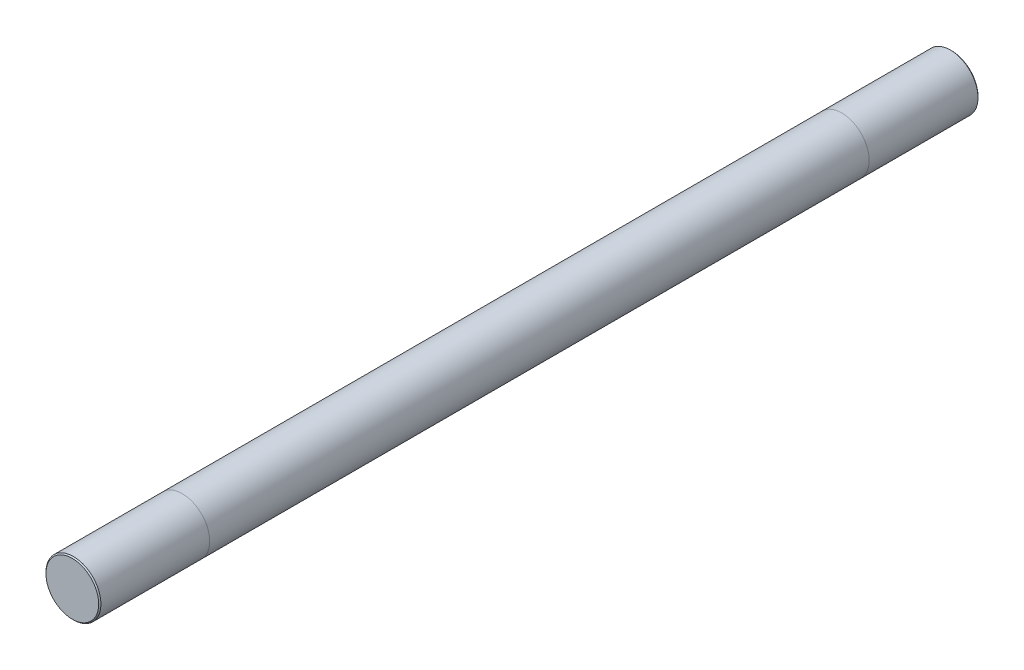
ISO-10303-21;
HEADER;
FILE_DESCRIPTION(('STEP AP214'),'2;1');
FILE_NAME('part.step','',(''),(''),'','','');
FILE_SCHEMA(('AUTOMOTIVE_DESIGN { 1 0 10303 214 1 1 1 1 }'));
ENDSEC;
DATA;
#1=APPLICATION_CONTEXT('core data for automotive mechanical design processes');
#2=APPLICATION_PROTOCOL_DEFINITION('international standard','automotive_design',2000,#1);
#3=PRODUCT_CONTEXT('',#1,'mechanical');
#4=PRODUCT('Part','Part','',(#3));
#5=PRODUCT_RELATED_PRODUCT_CATEGORY('part','',(#4));
#6=PRODUCT_DEFINITION_FORMATION('','',#4);
#7=PRODUCT_DEFINITION_CONTEXT('part definition',#1,'design');
#8=PRODUCT_DEFINITION('design','',#6,#7);
#9=PRODUCT_DEFINITION_SHAPE('','',#8);
#10=(LENGTH_UNIT() NAMED_UNIT(*) SI_UNIT(.MILLI.,.METRE.));
#11=(NAMED_UNIT(*) PLANE_ANGLE_UNIT() SI_UNIT($,.RADIAN.));
#12=(NAMED_UNIT(*) SI_UNIT($,.STERADIAN.) SOLID_ANGLE_UNIT());
#13=UNCERTAINTY_MEASURE_WITH_UNIT(LENGTH_MEASURE(1.E-05),#10,'distance_accuracy_value','');
#14=(GEOMETRIC_REPRESENTATION_CONTEXT(3) GLOBAL_UNCERTAINTY_ASSIGNED_CONTEXT((#13)) GLOBAL_UNIT_ASSIGNED_CONTEXT((#10,
#11,#12)) REPRESENTATION_CONTEXT('',''));
#15=CARTESIAN_POINT('',(0.,0.,0.));
#16=DIRECTION('',(0.,0.,1.));
#17=DIRECTION('',(1.,0.,0.));
#18=AXIS2_PLACEMENT_3D('',#15,#16,#17);
#19=CARTESIAN_POINT('',(0.,0.,50.8));
#20=DIRECTION('',(0.,0.,-1.));
#21=DIRECTION('',(-1.,0.,0.));
#22=AXIS2_PLACEMENT_3D('',#19,#20,#21);
#23=CYLINDRICAL_SURFACE('',#22,3.175);
#24=CARTESIAN_POINT('',(0.,0.,-50.673));
#25=DIRECTION('',(0.,0.,1.));
#26=DIRECTION('',(1.,0.,0.));
#27=AXIS2_PLACEMENT_3D('',#24,#25,#26);
#28=CIRCLE('',#27,3.175);
#29=CARTESIAN_POINT('',(3.175,0.,-50.673));
#30=VERTEX_POINT('',#29);
#31=EDGE_CURVE('E70',#30,#30,#28,.T.);
#32=ORIENTED_EDGE('',*,*,#31,.T.);
#33=EDGE_LOOP('',(#32));
#34=FACE_BOUND('',#33,.T.);
#35=CARTESIAN_POINT('',(0.,0.,-38.1));
#36=DIRECTION('',(0.,0.,-1.));
#37=DIRECTION('',(-1.,0.,0.));
#38=AXIS2_PLACEMENT_3D('',#35,#36,#37);
#39=CIRCLE('',#38,3.175);
#40=CARTESIAN_POINT('',(-3.175,0.,-38.1));
#41=VERTEX_POINT('',#40);
#42=EDGE_CURVE('E11',#41,#41,#39,.T.);
#43=ORIENTED_EDGE('',*,*,#42,.T.);
#44=EDGE_LOOP('',(#43));
#45=FACE_BOUND('',#44,.T.);
#46=ADVANCED_FACE('F45',(#34,#45),#23,.T.);
#47=CARTESIAN_POINT('',(0.,0.,50.673));
#48=DIRECTION('',(0.,0.,1.));
#49=DIRECTION('',(1.,0.,0.));
#50=AXIS2_PLACEMENT_3D('',#47,#48,#49);
#51=CIRCLE('',#50,3.175);
#52=CARTESIAN_POINT('',(3.175,0.,50.673));
#53=VERTEX_POINT('',#52);
#54=EDGE_CURVE('E73',#53,#53,#51,.F.);
#55=ORIENTED_EDGE('',*,*,#54,.T.);
#56=EDGE_LOOP('',(#55));
#57=FACE_BOUND('',#56,.T.);
#58=CARTESIAN_POINT('',(0.,0.,38.1));
#59=DIRECTION('',(0.,0.,1.));
#60=DIRECTION('',(1.,0.,0.));
#61=AXIS2_PLACEMENT_3D('',#58,#59,#60);
#62=CIRCLE('',#61,3.175);
#63=CARTESIAN_POINT('',(3.175,0.,38.1));
#64=VERTEX_POINT('',#63);
#65=EDGE_CURVE('E53',#64,#64,#62,.T.);
#66=ORIENTED_EDGE('',*,*,#65,.T.);
#67=EDGE_LOOP('',(#66));
#68=FACE_BOUND('',#67,.T.);
#69=ADVANCED_FACE('F78',(#57,#68),#23,.T.);
#70=ORIENTED_EDGE('',*,*,#42,.F.);
#71=EDGE_LOOP('',(#70));
#72=FACE_BOUND('',#71,.T.);
#73=ORIENTED_EDGE('',*,*,#65,.F.);
#74=EDGE_LOOP('',(#73));
#75=FACE_BOUND('',#74,.T.);
#76=ADVANCED_FACE('F88',(#72,#75),#23,.T.);
#77=CARTESIAN_POINT('',(0.,0.,50.8));
#78=DIRECTION('',(0.,0.,1.));
#79=DIRECTION('',(1.,0.,0.));
#80=AXIS2_PLACEMENT_3D('',#77,#78,#79);
#81=PLANE('',#80);
#82=CARTESIAN_POINT('',(0.,0.,50.8));
#83=DIRECTION('',(0.,0.,1.));
#84=DIRECTION('',(1.,0.,0.));
#85=AXIS2_PLACEMENT_3D('',#82,#83,#84);
#86=CIRCLE('',#85,3.04799999999998);
#87=CARTESIAN_POINT('',(3.04799999999998,0.,50.8));
#88=VERTEX_POINT('',#87);
#89=EDGE_CURVE('E59',#88,#88,#86,.T.);
#90=ORIENTED_EDGE('',*,*,#89,.T.);
#91=EDGE_LOOP('',(#90));
#92=FACE_BOUND('',#91,.T.);
#93=ADVANCED_FACE('F85',(#92),#81,.T.);
#94=CARTESIAN_POINT('',(0.,0.,-50.8));
#95=DIRECTION('',(0.,0.,1.));
#96=DIRECTION('',(1.,0.,0.));
#97=AXIS2_PLACEMENT_3D('',#94,#95,#96);
#98=PLANE('',#97);
#99=CARTESIAN_POINT('',(0.,0.,-50.8));
#100=DIRECTION('',(0.,0.,1.));
#101=DIRECTION('',(1.,0.,0.));
#102=AXIS2_PLACEMENT_3D('',#99,#100,#101);
#103=CIRCLE('',#102,3.04800000000001);
#104=CARTESIAN_POINT('',(3.04800000000001,0.,-50.8));
#105=VERTEX_POINT('',#104);
#106=EDGE_CURVE('E64',#105,#105,#103,.F.);
#107=ORIENTED_EDGE('',*,*,#106,.T.);
#108=EDGE_LOOP('',(#107));
#109=FACE_BOUND('',#108,.T.);
#110=ADVANCED_FACE('F87',(#109),#98,.F.);
#111=CARTESIAN_POINT('',(0.,0.,-50.673));
#112=DIRECTION('',(0.,0.,1.));
#113=DIRECTION('',(1.,0.,0.));
#114=AXIS2_PLACEMENT_3D('',#111,#112,#113);
#115=CONICAL_SURFACE('',#114,3.175,0.785398163397462);
#116=ORIENTED_EDGE('',*,*,#106,.F.);
#117=EDGE_LOOP('',(#116));
#118=FACE_BOUND('',#117,.T.);
#119=ORIENTED_EDGE('',*,*,#31,.F.);
#120=EDGE_LOOP('',(#119));
#121=FACE_BOUND('',#120,.T.);
#122=ADVANCED_FACE('F82',(#118,#121),#115,.T.);
#123=CARTESIAN_POINT('',(0.,0.,50.8));
#124=DIRECTION('',(0.,0.,-1.));
#125=DIRECTION('',(-1.,0.,0.));
#126=AXIS2_PLACEMENT_3D('',#123,#124,#125);
#127=CONICAL_SURFACE('',#126,3.04799999999998,0.785398163397462);
#128=ORIENTED_EDGE('',*,*,#54,.F.);
#129=EDGE_LOOP('',(#128));
#130=FACE_BOUND('',#129,.T.);
#131=ORIENTED_EDGE('',*,*,#89,.F.);
#132=EDGE_LOOP('',(#131));
#133=FACE_BOUND('',#132,.T.);
#134=ADVANCED_FACE('F47',(#130,#133),#127,.T.);
#135=CLOSED_SHELL('',(#46,#69,#76,#93,#110,#122,#134));
#136=MANIFOLD_SOLID_BREP('B2',#135);
#137=ADVANCED_BREP_SHAPE_REPRESENTATION('',(#18,#136),#14);
#138=SHAPE_DEFINITION_REPRESENTATION(#9,#137);
ENDSEC;
END-ISO-10303-21;
